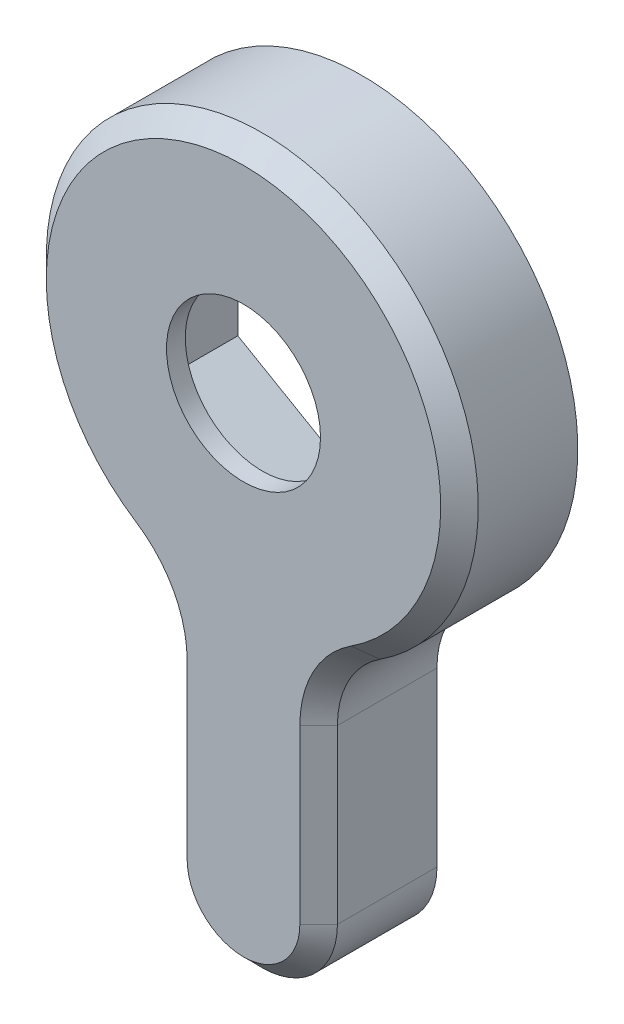
ISO-10303-21;
HEADER;
FILE_DESCRIPTION(('STEP AP214'),'2;1');
FILE_NAME('part.step','',(''),(''),'','','');
FILE_SCHEMA(('AUTOMOTIVE_DESIGN { 1 0 10303 214 1 1 1 1 }'));
ENDSEC;
DATA;
#1=APPLICATION_CONTEXT('core data for automotive mechanical design processes');
#2=APPLICATION_PROTOCOL_DEFINITION('international standard','automotive_design',2000,#1);
#3=PRODUCT_CONTEXT('',#1,'mechanical');
#4=PRODUCT('Part','Part','',(#3));
#5=PRODUCT_RELATED_PRODUCT_CATEGORY('part','',(#4));
#6=PRODUCT_DEFINITION_FORMATION('','',#4);
#7=PRODUCT_DEFINITION_CONTEXT('part definition',#1,'design');
#8=PRODUCT_DEFINITION('design','',#6,#7);
#9=PRODUCT_DEFINITION_SHAPE('','',#8);
#10=(LENGTH_UNIT() NAMED_UNIT(*) SI_UNIT(.MILLI.,.METRE.));
#11=(NAMED_UNIT(*) PLANE_ANGLE_UNIT() SI_UNIT($,.RADIAN.));
#12=(NAMED_UNIT(*) SI_UNIT($,.STERADIAN.) SOLID_ANGLE_UNIT());
#13=UNCERTAINTY_MEASURE_WITH_UNIT(LENGTH_MEASURE(1.E-05),#10,'distance_accuracy_value','');
#14=(GEOMETRIC_REPRESENTATION_CONTEXT(3) GLOBAL_UNCERTAINTY_ASSIGNED_CONTEXT((#13)) GLOBAL_UNIT_ASSIGNED_CONTEXT((#10,
#11,#12)) REPRESENTATION_CONTEXT('',''));
#15=CARTESIAN_POINT('',(0.,0.,0.));
#16=DIRECTION('',(0.,0.,1.));
#17=DIRECTION('',(1.,0.,0.));
#18=AXIS2_PLACEMENT_3D('',#15,#16,#17);
#19=CARTESIAN_POINT('',(0.,0.,-37.8269119345812));
#20=DIRECTION('',(0.,0.,1.));
#21=DIRECTION('',(1.,0.,0.));
#22=AXIS2_PLACEMENT_3D('',#19,#20,#21);
#23=CYLINDRICAL_SURFACE('',#22,11.5);
#24=DIRECTION('',(0.,0.,1.));
#25=VECTOR('',#24,1.);
#26=CARTESIAN_POINT('',(-6.27272727272727,-9.63861465989711,-37.8269119345812));
#27=LINE('',#26,#25);
#28=CARTESIAN_POINT('',(-6.27272727272727,-9.63861465989711,-5.30000000000001));
#29=VERTEX_POINT('',#28);
#30=CARTESIAN_POINT('',(-6.27272727272727,-9.63861465989711,0.));
#31=VERTEX_POINT('',#30);
#32=EDGE_CURVE('E244',#29,#31,#27,.T.);
#33=ORIENTED_EDGE('',*,*,#32,.T.);
#34=CARTESIAN_POINT('',(0.,0.,0.));
#35=DIRECTION('',(0.,0.,1.));
#36=DIRECTION('',(1.,0.,0.));
#37=AXIS2_PLACEMENT_3D('',#34,#35,#36);
#38=CIRCLE('',#37,11.5);
#39=CARTESIAN_POINT('',(6.27272727272728,-9.63861465989711,0.));
#40=VERTEX_POINT('',#39);
#41=EDGE_CURVE('E11',#31,#40,#38,.F.);
#42=ORIENTED_EDGE('',*,*,#41,.T.);
#43=DIRECTION('',(0.,0.,1.));
#44=VECTOR('',#43,1.);
#45=CARTESIAN_POINT('',(6.27272727272728,-9.63861465989711,-37.8269119345812));
#46=LINE('',#45,#44);
#47=CARTESIAN_POINT('',(6.27272727272728,-9.63861465989711,-5.30000000000001));
#48=VERTEX_POINT('',#47);
#49=EDGE_CURVE('E222',#40,#48,#46,.F.);
#50=ORIENTED_EDGE('',*,*,#49,.T.);
#51=CARTESIAN_POINT('',(0.,0.,-5.30000000000001));
#52=DIRECTION('',(0.,0.,-1.));
#53=DIRECTION('',(-1.,0.,0.));
#54=AXIS2_PLACEMENT_3D('',#51,#52,#53);
#55=CIRCLE('',#54,11.5);
#56=EDGE_CURVE('E185',#48,#29,#55,.F.);
#57=ORIENTED_EDGE('',*,*,#56,.T.);
#58=EDGE_LOOP('',(#33,#42,#50,#57));
#59=FACE_BOUND('',#58,.T.);
#60=ADVANCED_FACE('F41',(#59),#23,.T.);
#61=CARTESIAN_POINT('',(6.6,3.81051177665153,-37.8269119345812));
#62=DIRECTION('',(0.5,0.866025403784438,0.));
#63=DIRECTION('',(-0.866025403784438,0.5,0.));
#64=AXIS2_PLACEMENT_3D('',#61,#62,#63);
#65=PLANE('',#64);
#66=DIRECTION('',(-0.866025403784438,0.5,0.));
#67=VECTOR('',#66,1.);
#68=CARTESIAN_POINT('',(6.6,3.81051177665153,-5.30000000000001));
#69=LINE('',#68,#67);
#70=CARTESIAN_POINT('',(6.6,3.81051177665153,-5.30000000000001));
#71=VERTEX_POINT('',#70);
#72=CARTESIAN_POINT('',(0.,7.62102355330306,-5.30000000000001));
#73=VERTEX_POINT('',#72);
#74=EDGE_CURVE('E213',#71,#73,#69,.T.);
#75=ORIENTED_EDGE('',*,*,#74,.F.);
#76=DIRECTION('',(0.,0.,1.));
#77=VECTOR('',#76,1.);
#78=CARTESIAN_POINT('',(6.6,3.81051177665153,-37.8269119345812));
#79=LINE('',#78,#77);
#80=CARTESIAN_POINT('',(6.6,3.81051177665153,0.));
#81=VERTEX_POINT('',#80);
#82=EDGE_CURVE('E210',#71,#81,#79,.T.);
#83=ORIENTED_EDGE('',*,*,#82,.T.);
#84=DIRECTION('',(-0.866025403784439,0.5,0.));
#85=VECTOR('',#84,1.);
#86=CARTESIAN_POINT('',(6.6,3.81051177665153,0.));
#87=LINE('',#86,#85);
#88=CARTESIAN_POINT('',(0.,7.62102355330306,0.));
#89=VERTEX_POINT('',#88);
#90=EDGE_CURVE('E207',#81,#89,#87,.T.);
#91=ORIENTED_EDGE('',*,*,#90,.T.);
#92=DIRECTION('',(0.,0.,1.));
#93=VECTOR('',#92,1.);
#94=CARTESIAN_POINT('',(0.,7.62102355330306,-37.8269119345812));
#95=LINE('',#94,#93);
#96=EDGE_CURVE('E202',#73,#89,#95,.T.);
#97=ORIENTED_EDGE('',*,*,#96,.F.);
#98=EDGE_LOOP('',(#75,#83,#91,#97));
#99=FACE_BOUND('',#98,.T.);
#100=ADVANCED_FACE('F332',(#99),#65,.F.);
#101=CARTESIAN_POINT('',(6.6,-3.81051177665153,-37.8269119345812));
#102=DIRECTION('',(1.,0.,0.));
#103=DIRECTION('',(0.,0.,-1.));
#104=AXIS2_PLACEMENT_3D('',#101,#102,#103);
#105=PLANE('',#104);
#106=DIRECTION('',(0.,1.,0.));
#107=VECTOR('',#106,1.);
#108=CARTESIAN_POINT('',(6.6,-3.81051177665153,-5.30000000000001));
#109=LINE('',#108,#107);
#110=CARTESIAN_POINT('',(6.6,-3.81051177665153,-5.30000000000001));
#111=VERTEX_POINT('',#110);
#112=EDGE_CURVE('E206',#111,#71,#109,.T.);
#113=ORIENTED_EDGE('',*,*,#112,.F.);
#114=DIRECTION('',(0.,0.,1.));
#115=VECTOR('',#114,1.);
#116=CARTESIAN_POINT('',(6.6,-3.81051177665153,-37.8269119345812));
#117=LINE('',#116,#115);
#118=CARTESIAN_POINT('',(6.6,-3.81051177665153,0.));
#119=VERTEX_POINT('',#118);
#120=EDGE_CURVE('E190',#111,#119,#117,.T.);
#121=ORIENTED_EDGE('',*,*,#120,.T.);
#122=DIRECTION('',(0.,1.,0.));
#123=VECTOR('',#122,1.);
#124=CARTESIAN_POINT('',(6.6,-3.81051177665153,0.));
#125=LINE('',#124,#123);
#126=EDGE_CURVE('E186',#119,#81,#125,.T.);
#127=ORIENTED_EDGE('',*,*,#126,.T.);
#128=ORIENTED_EDGE('',*,*,#82,.F.);
#129=EDGE_LOOP('',(#113,#121,#127,#128));
#130=FACE_BOUND('',#129,.T.);
#131=ADVANCED_FACE('F337',(#130),#105,.F.);
#132=CARTESIAN_POINT('',(0.,-7.62102355330306,-37.8269119345812));
#133=DIRECTION('',(0.5,-0.866025403784438,0.));
#134=DIRECTION('',(0.866025403784438,0.5,0.));
#135=AXIS2_PLACEMENT_3D('',#132,#133,#134);
#136=PLANE('',#135);
#137=DIRECTION('',(0.866025403784438,0.5,0.));
#138=VECTOR('',#137,1.);
#139=CARTESIAN_POINT('',(0.,-7.62102355330306,-5.30000000000001));
#140=LINE('',#139,#138);
#141=CARTESIAN_POINT('',(0.,-7.62102355330306,-5.30000000000001));
#142=VERTEX_POINT('',#141);
#143=EDGE_CURVE('E219',#142,#111,#140,.T.);
#144=ORIENTED_EDGE('',*,*,#143,.F.);
#145=DIRECTION('',(0.,0.,1.));
#146=VECTOR('',#145,1.);
#147=CARTESIAN_POINT('',(0.,-7.62102355330306,-37.8269119345812));
#148=LINE('',#147,#146);
#149=CARTESIAN_POINT('',(0.,-7.62102355330306,0.));
#150=VERTEX_POINT('',#149);
#151=EDGE_CURVE('E189',#142,#150,#148,.T.);
#152=ORIENTED_EDGE('',*,*,#151,.T.);
#153=DIRECTION('',(0.866025403784438,0.5,0.));
#154=VECTOR('',#153,1.);
#155=CARTESIAN_POINT('',(0.,-7.62102355330306,0.));
#156=LINE('',#155,#154);
#157=EDGE_CURVE('E191',#150,#119,#156,.T.);
#158=ORIENTED_EDGE('',*,*,#157,.T.);
#159=ORIENTED_EDGE('',*,*,#120,.F.);
#160=EDGE_LOOP('',(#144,#152,#158,#159));
#161=FACE_BOUND('',#160,.T.);
#162=ADVANCED_FACE('F352',(#161),#136,.F.);
#163=CARTESIAN_POINT('',(-6.6,-3.81051177665153,-37.8269119345812));
#164=DIRECTION('',(-0.5,-0.866025403784439,0.));
#165=DIRECTION('',(0.866025403784439,-0.5,0.));
#166=AXIS2_PLACEMENT_3D('',#163,#164,#165);
#167=PLANE('',#166);
#168=DIRECTION('',(0.866025403784439,-0.5,0.));
#169=VECTOR('',#168,1.);
#170=CARTESIAN_POINT('',(-6.6,-3.81051177665153,-5.30000000000001));
#171=LINE('',#170,#169);
#172=CARTESIAN_POINT('',(-6.6,-3.81051177665153,-5.30000000000001));
#173=VERTEX_POINT('',#172);
#174=EDGE_CURVE('E223',#173,#142,#171,.T.);
#175=ORIENTED_EDGE('',*,*,#174,.F.);
#176=DIRECTION('',(0.,0.,1.));
#177=VECTOR('',#176,1.);
#178=CARTESIAN_POINT('',(-6.6,-3.81051177665153,-37.8269119345812));
#179=LINE('',#178,#177);
#180=CARTESIAN_POINT('',(-6.6,-3.81051177665153,0.));
#181=VERTEX_POINT('',#180);
#182=EDGE_CURVE('E194',#173,#181,#179,.T.);
#183=ORIENTED_EDGE('',*,*,#182,.T.);
#184=DIRECTION('',(0.866025403784439,-0.5,0.));
#185=VECTOR('',#184,1.);
#186=CARTESIAN_POINT('',(-6.6,-3.81051177665153,0.));
#187=LINE('',#186,#185);
#188=EDGE_CURVE('E195',#181,#150,#187,.T.);
#189=ORIENTED_EDGE('',*,*,#188,.T.);
#190=ORIENTED_EDGE('',*,*,#151,.F.);
#191=EDGE_LOOP('',(#175,#183,#189,#190));
#192=FACE_BOUND('',#191,.T.);
#193=ADVANCED_FACE('F348',(#192),#167,.F.);
#194=CARTESIAN_POINT('',(-6.6,3.81051177665153,-37.8269119345812));
#195=DIRECTION('',(-1.,0.,0.));
#196=DIRECTION('',(0.,-1.,0.));
#197=AXIS2_PLACEMENT_3D('',#194,#195,#196);
#198=PLANE('',#197);
#199=DIRECTION('',(0.,-1.,0.));
#200=VECTOR('',#199,1.);
#201=CARTESIAN_POINT('',(-6.6,3.81051177665153,-5.30000000000001));
#202=LINE('',#201,#200);
#203=CARTESIAN_POINT('',(-6.6,3.81051177665153,-5.30000000000001));
#204=VERTEX_POINT('',#203);
#205=EDGE_CURVE('E226',#204,#173,#202,.T.);
#206=ORIENTED_EDGE('',*,*,#205,.F.);
#207=DIRECTION('',(0.,0.,1.));
#208=VECTOR('',#207,1.);
#209=CARTESIAN_POINT('',(-6.6,3.81051177665153,-37.8269119345812));
#210=LINE('',#209,#208);
#211=CARTESIAN_POINT('',(-6.6,3.81051177665153,0.));
#212=VERTEX_POINT('',#211);
#213=EDGE_CURVE('E198',#204,#212,#210,.T.);
#214=ORIENTED_EDGE('',*,*,#213,.T.);
#215=DIRECTION('',(0.,-1.,0.));
#216=VECTOR('',#215,1.);
#217=CARTESIAN_POINT('',(-6.6,3.81051177665153,0.));
#218=LINE('',#217,#216);
#219=EDGE_CURVE('E199',#212,#181,#218,.T.);
#220=ORIENTED_EDGE('',*,*,#219,.T.);
#221=ORIENTED_EDGE('',*,*,#182,.F.);
#222=EDGE_LOOP('',(#206,#214,#220,#221));
#223=FACE_BOUND('',#222,.T.);
#224=ADVANCED_FACE('F344',(#223),#198,.F.);
#225=CARTESIAN_POINT('',(0.,7.62102355330306,-37.8269119345812));
#226=DIRECTION('',(-0.5,0.866025403784438,0.));
#227=DIRECTION('',(-0.866025403784439,-0.5,0.));
#228=AXIS2_PLACEMENT_3D('',#225,#226,#227);
#229=PLANE('',#228);
#230=DIRECTION('',(-0.866025403784439,-0.5,0.));
#231=VECTOR('',#230,1.);
#232=CARTESIAN_POINT('',(0.,7.62102355330306,-5.30000000000001));
#233=LINE('',#232,#231);
#234=EDGE_CURVE('E216',#73,#204,#233,.T.);
#235=ORIENTED_EDGE('',*,*,#234,.F.);
#236=ORIENTED_EDGE('',*,*,#96,.T.);
#237=DIRECTION('',(-0.866025403784438,-0.5,0.));
#238=VECTOR('',#237,1.);
#239=CARTESIAN_POINT('',(0.,7.62102355330306,0.));
#240=LINE('',#239,#238);
#241=EDGE_CURVE('E203',#89,#212,#240,.T.);
#242=ORIENTED_EDGE('',*,*,#241,.T.);
#243=ORIENTED_EDGE('',*,*,#213,.F.);
#244=EDGE_LOOP('',(#235,#236,#242,#243));
#245=FACE_BOUND('',#244,.T.);
#246=ADVANCED_FACE('F341',(#245),#229,.F.);
#247=CARTESIAN_POINT('',(0.,0.,-5.30000000000001));
#248=DIRECTION('',(0.,0.,-1.));
#249=DIRECTION('',(-0.999999767659061,-0.000681675747471521,0.));
#250=AXIS2_PLACEMENT_3D('',#247,#248,#249);
#251=PLANE('',#250);
#252=ORIENTED_EDGE('',*,*,#56,.F.);
#253=CARTESIAN_POINT('',(9.,-13.8293166859393,-5.30000000000001));
#254=DIRECTION('',(0.,0.,-1.));
#255=DIRECTION('',(-1.,0.,0.));
#256=AXIS2_PLACEMENT_3D('',#253,#254,#255);
#257=CIRCLE('',#256,5.);
#258=CARTESIAN_POINT('',(4.,-13.8293166859393,-5.30000000000001));
#259=VERTEX_POINT('',#258);
#260=EDGE_CURVE('E160',#48,#259,#257,.F.);
#261=ORIENTED_EDGE('',*,*,#260,.T.);
#262=DIRECTION('',(0.,-1.,0.));
#263=VECTOR('',#262,1.);
#264=CARTESIAN_POINT('',(4.,0.,-5.30000000000001));
#265=LINE('',#264,#263);
#266=CARTESIAN_POINT('',(4.,-23.,-5.30000000000001));
#267=VERTEX_POINT('',#266);
#268=EDGE_CURVE('E150',#259,#267,#265,.T.);
#269=ORIENTED_EDGE('',*,*,#268,.T.);
#270=CARTESIAN_POINT('',(0.,-23.,-5.30000000000001));
#271=DIRECTION('',(0.,0.,-1.));
#272=DIRECTION('',(-1.,0.,0.));
#273=AXIS2_PLACEMENT_3D('',#270,#271,#272);
#274=CIRCLE('',#273,4.);
#275=CARTESIAN_POINT('',(-4.,-23.,-5.30000000000001));
#276=VERTEX_POINT('',#275);
#277=EDGE_CURVE('E157',#276,#267,#274,.F.);
#278=ORIENTED_EDGE('',*,*,#277,.F.);
#279=DIRECTION('',(0.,-1.,0.));
#280=VECTOR('',#279,1.);
#281=CARTESIAN_POINT('',(-4.,0.,-5.30000000000001));
#282=LINE('',#281,#280);
#283=CARTESIAN_POINT('',(-4.,-13.8293166859393,-5.30000000000001));
#284=VERTEX_POINT('',#283);
#285=EDGE_CURVE('E173',#284,#276,#282,.T.);
#286=ORIENTED_EDGE('',*,*,#285,.F.);
#287=CARTESIAN_POINT('',(-9.,-13.8293166859393,-5.30000000000001));
#288=DIRECTION('',(0.,0.,-1.));
#289=DIRECTION('',(-1.,0.,0.));
#290=AXIS2_PLACEMENT_3D('',#287,#288,#289);
#291=CIRCLE('',#290,5.);
#292=EDGE_CURVE('E250',#284,#29,#291,.F.);
#293=ORIENTED_EDGE('',*,*,#292,.T.);
#294=EDGE_LOOP('',(#252,#261,#269,#278,#286,#293));
#295=FACE_BOUND('',#294,.T.);
#296=ORIENTED_EDGE('',*,*,#112,.T.);
#297=ORIENTED_EDGE('',*,*,#74,.T.);
#298=ORIENTED_EDGE('',*,*,#234,.T.);
#299=ORIENTED_EDGE('',*,*,#205,.T.);
#300=ORIENTED_EDGE('',*,*,#174,.T.);
#301=ORIENTED_EDGE('',*,*,#143,.T.);
#302=EDGE_LOOP('',(#296,#297,#298,#299,#300,#301));
#303=FACE_BOUND('',#302,.T.);
#304=ADVANCED_FACE('F153',(#295,#303),#251,.T.);
#305=CARTESIAN_POINT('',(0.,0.,0.));
#306=DIRECTION('',(0.,0.,1.));
#307=DIRECTION('',(1.,0.,0.));
#308=AXIS2_PLACEMENT_3D('',#305,#306,#307);
#309=PLANE('',#308);
#310=CARTESIAN_POINT('',(0.,0.,0.));
#311=DIRECTION('',(0.,0.,1.));
#312=DIRECTION('',(1.,0.,0.));
#313=AXIS2_PLACEMENT_3D('',#310,#311,#312);
#314=CIRCLE('',#313,4.1);
#315=CARTESIAN_POINT('',(4.1,0.,0.));
#316=VERTEX_POINT('',#315);
#317=EDGE_CURVE('E181',#316,#316,#314,.F.);
#318=ORIENTED_EDGE('',*,*,#317,.F.);
#319=EDGE_LOOP('',(#318));
#320=FACE_BOUND('',#319,.T.);
#321=ORIENTED_EDGE('',*,*,#90,.F.);
#322=ORIENTED_EDGE('',*,*,#126,.F.);
#323=ORIENTED_EDGE('',*,*,#157,.F.);
#324=ORIENTED_EDGE('',*,*,#188,.F.);
#325=ORIENTED_EDGE('',*,*,#219,.F.);
#326=ORIENTED_EDGE('',*,*,#241,.F.);
#327=EDGE_LOOP('',(#321,#322,#323,#324,#325,#326));
#328=FACE_BOUND('',#327,.T.);
#329=ADVANCED_FACE('F320',(#320,#328),#309,.F.);
#330=CARTESIAN_POINT('',(0.,0.,1.));
#331=DIRECTION('',(0.,0.,1.));
#332=DIRECTION('',(1.,0.,0.));
#333=AXIS2_PLACEMENT_3D('',#330,#331,#332);
#334=PLANE('',#333);
#335=CARTESIAN_POINT('',(0.,0.,1.));
#336=DIRECTION('',(0.,0.,1.));
#337=DIRECTION('',(1.,0.,0.));
#338=AXIS2_PLACEMENT_3D('',#335,#336,#337);
#339=CIRCLE('',#338,4.1);
#340=CARTESIAN_POINT('',(4.1,0.,0.999999999999999));
#341=VERTEX_POINT('',#340);
#342=EDGE_CURVE('E536',#341,#341,#339,.T.);
#343=ORIENTED_EDGE('',*,*,#342,.F.);
#344=EDGE_LOOP('',(#343));
#345=FACE_BOUND('',#344,.T.);
#346=DIRECTION('',(0.,-1.,0.));
#347=VECTOR('',#346,1.);
#348=CARTESIAN_POINT('',(-2.99999999999999,0.,1.));
#349=LINE('',#348,#347);
#350=CARTESIAN_POINT('',(-2.99999999999999,-13.8293166859393,1.));
#351=VERTEX_POINT('',#350);
#352=CARTESIAN_POINT('',(-2.99999999999999,-23.,1.));
#353=VERTEX_POINT('',#352);
#354=EDGE_CURVE('E259',#351,#353,#349,.T.);
#355=ORIENTED_EDGE('',*,*,#354,.T.);
#356=CARTESIAN_POINT('',(0.,-23.,1.));
#357=DIRECTION('',(0.,0.,1.));
#358=DIRECTION('',(1.,0.,0.));
#359=AXIS2_PLACEMENT_3D('',#356,#357,#358);
#360=CIRCLE('',#359,2.99999999999999);
#361=CARTESIAN_POINT('',(3.,-23.,1.));
#362=VERTEX_POINT('',#361);
#363=EDGE_CURVE('E263',#353,#362,#360,.T.);
#364=ORIENTED_EDGE('',*,*,#363,.T.);
#365=DIRECTION('',(0.,1.,0.));
#366=VECTOR('',#365,1.);
#367=CARTESIAN_POINT('',(3.,-13.8293166859393,1.));
#368=LINE('',#367,#366);
#369=CARTESIAN_POINT('',(3.,-13.8293166859393,1.));
#370=VERTEX_POINT('',#369);
#371=EDGE_CURVE('E261',#362,#370,#368,.T.);
#372=ORIENTED_EDGE('',*,*,#371,.T.);
#373=CARTESIAN_POINT('',(9.,-13.8293166859393,1.));
#374=DIRECTION('',(0.,0.,1.));
#375=DIRECTION('',(1.,0.,0.));
#376=AXIS2_PLACEMENT_3D('',#373,#374,#375);
#377=CIRCLE('',#376,6.);
#378=CARTESIAN_POINT('',(5.72727272727273,-8.80047425468866,1.));
#379=VERTEX_POINT('',#378);
#380=EDGE_CURVE('E257',#370,#379,#377,.F.);
#381=ORIENTED_EDGE('',*,*,#380,.T.);
#382=CARTESIAN_POINT('',(0.,0.,1.));
#383=DIRECTION('',(0.,0.,1.));
#384=DIRECTION('',(1.,0.,0.));
#385=AXIS2_PLACEMENT_3D('',#382,#383,#384);
#386=CIRCLE('',#385,10.5);
#387=CARTESIAN_POINT('',(-5.72727272727272,-8.80047425468866,1.));
#388=VERTEX_POINT('',#387);
#389=EDGE_CURVE('E253',#379,#388,#386,.T.);
#390=ORIENTED_EDGE('',*,*,#389,.T.);
#391=CARTESIAN_POINT('',(-9.,-13.8293166859393,1.));
#392=DIRECTION('',(0.,0.,1.));
#393=DIRECTION('',(1.,0.,0.));
#394=AXIS2_PLACEMENT_3D('',#391,#392,#393);
#395=CIRCLE('',#394,6.00000000000001);
#396=EDGE_CURVE('E255',#388,#351,#395,.F.);
#397=ORIENTED_EDGE('',*,*,#396,.T.);
#398=EDGE_LOOP('',(#355,#364,#372,#381,#390,#397));
#399=FACE_BOUND('',#398,.T.);
#400=ADVANCED_FACE('F318',(#345,#399),#334,.T.);
#401=CARTESIAN_POINT('',(0.,-23.,-23.3838551302843));
#402=DIRECTION('',(0.,0.,1.));
#403=DIRECTION('',(1.,0.,0.));
#404=AXIS2_PLACEMENT_3D('',#401,#402,#403);
#405=CYLINDRICAL_SURFACE('',#404,4.);
#406=DIRECTION('',(0.,0.,1.));
#407=VECTOR('',#406,1.);
#408=CARTESIAN_POINT('',(4.,-23.,-23.3838551302843));
#409=LINE('',#408,#407);
#410=CARTESIAN_POINT('',(4.,-23.,0.));
#411=VERTEX_POINT('',#410);
#412=EDGE_CURVE('E166',#267,#411,#409,.T.);
#413=ORIENTED_EDGE('',*,*,#412,.T.);
#414=CARTESIAN_POINT('',(0.,-23.,0.));
#415=DIRECTION('',(0.,0.,1.));
#416=DIRECTION('',(1.,0.,0.));
#417=AXIS2_PLACEMENT_3D('',#414,#415,#416);
#418=CIRCLE('',#417,4.);
#419=CARTESIAN_POINT('',(-4.,-23.,0.));
#420=VERTEX_POINT('',#419);
#421=EDGE_CURVE('E266',#411,#420,#418,.F.);
#422=ORIENTED_EDGE('',*,*,#421,.T.);
#423=DIRECTION('',(0.,0.,1.));
#424=VECTOR('',#423,1.);
#425=CARTESIAN_POINT('',(-4.,-23.,-23.3838551302843));
#426=LINE('',#425,#424);
#427=EDGE_CURVE('E177',#276,#420,#426,.T.);
#428=ORIENTED_EDGE('',*,*,#427,.F.);
#429=ORIENTED_EDGE('',*,*,#277,.T.);
#430=EDGE_LOOP('',(#413,#422,#428,#429));
#431=FACE_BOUND('',#430,.T.);
#432=ADVANCED_FACE('F175',(#431),#405,.T.);
#433=CARTESIAN_POINT('',(4.,0.,-23.3838551302843));
#434=DIRECTION('',(-1.,0.,0.));
#435=DIRECTION('',(0.,-1.,0.));
#436=AXIS2_PLACEMENT_3D('',#433,#434,#435);
#437=PLANE('',#436);
#438=DIRECTION('',(0.,0.,1.));
#439=VECTOR('',#438,1.);
#440=CARTESIAN_POINT('',(4.,-13.8293166859393,-23.3838551302843));
#441=LINE('',#440,#439);
#442=CARTESIAN_POINT('',(4.,-13.8293166859393,0.));
#443=VERTEX_POINT('',#442);
#444=EDGE_CURVE('E248',#259,#443,#441,.T.);
#445=ORIENTED_EDGE('',*,*,#444,.T.);
#446=DIRECTION('',(0.,-1.,0.));
#447=VECTOR('',#446,1.);
#448=CARTESIAN_POINT('',(4.,-23.,0.));
#449=LINE('',#448,#447);
#450=EDGE_CURVE('E169',#443,#411,#449,.T.);
#451=ORIENTED_EDGE('',*,*,#450,.T.);
#452=ORIENTED_EDGE('',*,*,#412,.F.);
#453=ORIENTED_EDGE('',*,*,#268,.F.);
#454=EDGE_LOOP('',(#445,#451,#452,#453));
#455=FACE_BOUND('',#454,.T.);
#456=ADVANCED_FACE('F167',(#455),#437,.F.);
#457=CARTESIAN_POINT('',(-4.,0.,-23.3838551302843));
#458=DIRECTION('',(-1.,0.,0.));
#459=DIRECTION('',(0.,-1.,0.));
#460=AXIS2_PLACEMENT_3D('',#457,#458,#459);
#461=PLANE('',#460);
#462=ORIENTED_EDGE('',*,*,#427,.T.);
#463=DIRECTION('',(0.,1.,0.));
#464=VECTOR('',#463,1.);
#465=CARTESIAN_POINT('',(-4.,0.,0.));
#466=LINE('',#465,#464);
#467=CARTESIAN_POINT('',(-4.,-13.8293166859393,0.));
#468=VERTEX_POINT('',#467);
#469=EDGE_CURVE('E269',#420,#468,#466,.T.);
#470=ORIENTED_EDGE('',*,*,#469,.T.);
#471=DIRECTION('',(0.,0.,-1.));
#472=VECTOR('',#471,1.);
#473=CARTESIAN_POINT('',(-4.,-13.8293166859393,-5.30000000000001));
#474=LINE('',#473,#472);
#475=EDGE_CURVE('E246',#468,#284,#474,.T.);
#476=ORIENTED_EDGE('',*,*,#475,.T.);
#477=ORIENTED_EDGE('',*,*,#285,.T.);
#478=EDGE_LOOP('',(#462,#470,#476,#477));
#479=FACE_BOUND('',#478,.T.);
#480=ADVANCED_FACE('F304',(#479),#461,.T.);
#481=CARTESIAN_POINT('',(-9.,-13.8293166859393,-37.8269119345812));
#482=DIRECTION('',(0.,0.,1.));
#483=DIRECTION('',(1.,0.,0.));
#484=AXIS2_PLACEMENT_3D('',#481,#482,#483);
#485=CYLINDRICAL_SURFACE('',#484,5.);
#486=ORIENTED_EDGE('',*,*,#475,.F.);
#487=CARTESIAN_POINT('',(-9.,-13.8293166859393,0.));
#488=DIRECTION('',(0.,0.,1.));
#489=DIRECTION('',(1.,0.,0.));
#490=AXIS2_PLACEMENT_3D('',#487,#488,#489);
#491=CIRCLE('',#490,5.);
#492=EDGE_CURVE('E51',#468,#31,#491,.T.);
#493=ORIENTED_EDGE('',*,*,#492,.T.);
#494=ORIENTED_EDGE('',*,*,#32,.F.);
#495=ORIENTED_EDGE('',*,*,#292,.F.);
#496=EDGE_LOOP('',(#486,#493,#494,#495));
#497=FACE_BOUND('',#496,.T.);
#498=ADVANCED_FACE('F302',(#497),#485,.F.);
#499=CARTESIAN_POINT('',(9.,-13.8293166859393,-37.8269119345812));
#500=DIRECTION('',(0.,0.,1.));
#501=DIRECTION('',(1.,0.,0.));
#502=AXIS2_PLACEMENT_3D('',#499,#500,#501);
#503=CYLINDRICAL_SURFACE('',#502,5.);
#504=ORIENTED_EDGE('',*,*,#49,.F.);
#505=CARTESIAN_POINT('',(9.,-13.8293166859393,0.));
#506=DIRECTION('',(0.,0.,1.));
#507=DIRECTION('',(1.,0.,0.));
#508=AXIS2_PLACEMENT_3D('',#505,#506,#507);
#509=CIRCLE('',#508,5.);
#510=EDGE_CURVE('E271',#40,#443,#509,.T.);
#511=ORIENTED_EDGE('',*,*,#510,.T.);
#512=ORIENTED_EDGE('',*,*,#444,.F.);
#513=ORIENTED_EDGE('',*,*,#260,.F.);
#514=EDGE_LOOP('',(#504,#511,#512,#513));
#515=FACE_BOUND('',#514,.T.);
#516=ADVANCED_FACE('F300',(#515),#503,.F.);
#517=CARTESIAN_POINT('',(0.,0.,1.));
#518=DIRECTION('',(0.,0.,-1.));
#519=DIRECTION('',(-1.,0.,0.));
#520=AXIS2_PLACEMENT_3D('',#517,#518,#519);
#521=CONICAL_SURFACE('',#520,10.5,0.785398163397447);
#522=DIRECTION('',(-0.385694607919936,0.592654764109331,0.707106781186548));
#523=VECTOR('',#522,1.);
#524=CARTESIAN_POINT('',(6.27272727272728,-9.63861465989711,0.));
#525=LINE('',#524,#523);
#526=EDGE_CURVE('E283',#40,#379,#525,.T.);
#527=ORIENTED_EDGE('',*,*,#526,.F.);
#528=ORIENTED_EDGE('',*,*,#41,.F.);
#529=DIRECTION('',(-0.385694607919935,-0.592654764109332,-0.707106781186548));
#530=VECTOR('',#529,1.);
#531=CARTESIAN_POINT('',(-5.72727272727272,-8.80047425468866,1.));
#532=LINE('',#531,#530);
#533=EDGE_CURVE('E46',#388,#31,#532,.T.);
#534=ORIENTED_EDGE('',*,*,#533,.F.);
#535=ORIENTED_EDGE('',*,*,#389,.F.);
#536=EDGE_LOOP('',(#527,#528,#534,#535));
#537=FACE_BOUND('',#536,.T.);
#538=ADVANCED_FACE('F44',(#537),#521,.T.);
#539=CARTESIAN_POINT('',(-9.,-13.8293166859393,1.));
#540=DIRECTION('',(0.,0.,1.));
#541=DIRECTION('',(1.,0.,0.));
#542=AXIS2_PLACEMENT_3D('',#539,#540,#541);
#543=CONICAL_SURFACE('',#542,6.00000000000001,0.785398163397447);
#544=ORIENTED_EDGE('',*,*,#533,.T.);
#545=ORIENTED_EDGE('',*,*,#492,.F.);
#546=DIRECTION('',(-0.707106781186547,0.,-0.707106781186548));
#547=VECTOR('',#546,1.);
#548=CARTESIAN_POINT('',(-2.99999999999999,-13.8293166859393,1.));
#549=LINE('',#548,#547);
#550=EDGE_CURVE('E281',#351,#468,#549,.T.);
#551=ORIENTED_EDGE('',*,*,#550,.F.);
#552=ORIENTED_EDGE('',*,*,#396,.F.);
#553=EDGE_LOOP('',(#544,#545,#551,#552));
#554=FACE_BOUND('',#553,.T.);
#555=ADVANCED_FACE('F293',(#554),#543,.F.);
#556=CARTESIAN_POINT('',(9.,-13.8293166859393,1.));
#557=DIRECTION('',(0.,0.,1.));
#558=DIRECTION('',(1.,0.,0.));
#559=AXIS2_PLACEMENT_3D('',#556,#557,#558);
#560=CONICAL_SURFACE('',#559,6.00000000000001,0.785398163397447);
#561=ORIENTED_EDGE('',*,*,#526,.T.);
#562=ORIENTED_EDGE('',*,*,#380,.F.);
#563=DIRECTION('',(-0.707106781186547,0.,0.707106781186548));
#564=VECTOR('',#563,1.);
#565=CARTESIAN_POINT('',(4.,-13.8293166859393,0.));
#566=LINE('',#565,#564);
#567=EDGE_CURVE('E278',#443,#370,#566,.T.);
#568=ORIENTED_EDGE('',*,*,#567,.F.);
#569=ORIENTED_EDGE('',*,*,#510,.F.);
#570=EDGE_LOOP('',(#561,#562,#568,#569));
#571=FACE_BOUND('',#570,.T.);
#572=ADVANCED_FACE('F298',(#571),#560,.F.);
#573=CARTESIAN_POINT('',(-2.99999999999999,0.,1.));
#574=DIRECTION('',(0.707106781186547,0.,-0.707106781186548));
#575=DIRECTION('',(0.,-1.,0.));
#576=AXIS2_PLACEMENT_3D('',#573,#574,#575);
#577=PLANE('',#576);
#578=ORIENTED_EDGE('',*,*,#550,.T.);
#579=ORIENTED_EDGE('',*,*,#469,.F.);
#580=DIRECTION('',(-0.707106781186548,0.,-0.707106781186546));
#581=VECTOR('',#580,1.);
#582=CARTESIAN_POINT('',(-2.99999999999999,-23.,1.));
#583=LINE('',#582,#581);
#584=EDGE_CURVE('E276',#353,#420,#583,.T.);
#585=ORIENTED_EDGE('',*,*,#584,.F.);
#586=ORIENTED_EDGE('',*,*,#354,.F.);
#587=EDGE_LOOP('',(#578,#579,#585,#586));
#588=FACE_BOUND('',#587,.T.);
#589=ADVANCED_FACE('F308',(#588),#577,.F.);
#590=CARTESIAN_POINT('',(4.,0.,0.));
#591=DIRECTION('',(0.707106781186547,0.,0.707106781186548));
#592=DIRECTION('',(0.,1.,0.));
#593=AXIS2_PLACEMENT_3D('',#590,#591,#592);
#594=PLANE('',#593);
#595=ORIENTED_EDGE('',*,*,#567,.T.);
#596=ORIENTED_EDGE('',*,*,#371,.F.);
#597=DIRECTION('',(-0.707106781186549,0.,0.707106781186546));
#598=VECTOR('',#597,1.);
#599=CARTESIAN_POINT('',(4.,-23.,0.));
#600=LINE('',#599,#598);
#601=EDGE_CURVE('E274',#411,#362,#600,.T.);
#602=ORIENTED_EDGE('',*,*,#601,.F.);
#603=ORIENTED_EDGE('',*,*,#450,.F.);
#604=EDGE_LOOP('',(#595,#596,#602,#603));
#605=FACE_BOUND('',#604,.T.);
#606=ADVANCED_FACE('F316',(#605),#594,.T.);
#607=CARTESIAN_POINT('',(0.,-23.,1.));
#608=DIRECTION('',(0.,0.,-1.));
#609=DIRECTION('',(-1.,0.,0.));
#610=AXIS2_PLACEMENT_3D('',#607,#608,#609);
#611=CONICAL_SURFACE('',#610,2.99999999999999,0.785398163397449);
#612=ORIENTED_EDGE('',*,*,#584,.T.);
#613=ORIENTED_EDGE('',*,*,#421,.F.);
#614=ORIENTED_EDGE('',*,*,#601,.T.);
#615=ORIENTED_EDGE('',*,*,#363,.F.);
#616=EDGE_LOOP('',(#612,#613,#614,#615));
#617=FACE_BOUND('',#616,.T.);
#618=ADVANCED_FACE('F313',(#617),#611,.T.);
#619=CARTESIAN_POINT('',(0.,0.,-5.30100000000001));
#620=DIRECTION('',(0.,0.,1.));
#621=DIRECTION('',(1.,0.,0.));
#622=AXIS2_PLACEMENT_3D('',#619,#620,#621);
#623=CYLINDRICAL_SURFACE('',#622,4.1);
#624=CARTESIAN_POINT('',(4.1,0.,0.999999999999999));
#625=CARTESIAN_POINT('',(4.1,0.,0.989583333333333));
#626=CARTESIAN_POINT('',(4.1,0.,0.979166666666666));
#627=CARTESIAN_POINT('',(4.1,0.,0.958333333333332));
#628=CARTESIAN_POINT('',(4.1,0.,0.947916666666666));
#629=CARTESIAN_POINT('',(4.1,0.,0.927083333333332));
#630=CARTESIAN_POINT('',(4.1,0.,0.916666666666666));
#631=CARTESIAN_POINT('',(4.1,0.,0.895833333333332));
#632=CARTESIAN_POINT('',(4.1,0.,0.885416666666666));
#633=CARTESIAN_POINT('',(4.1,0.,0.864583333333332));
#634=CARTESIAN_POINT('',(4.1,0.,0.854166666666666));
#635=CARTESIAN_POINT('',(4.1,0.,0.833333333333332));
#636=CARTESIAN_POINT('',(4.1,0.,0.822916666666666));
#637=CARTESIAN_POINT('',(4.1,0.,0.802083333333332));
#638=CARTESIAN_POINT('',(4.1,0.,0.791666666666666));
#639=CARTESIAN_POINT('',(4.1,0.,0.770833333333332));
#640=CARTESIAN_POINT('',(4.1,0.,0.760416666666666));
#641=CARTESIAN_POINT('',(4.1,0.,0.739583333333333));
#642=CARTESIAN_POINT('',(4.1,0.,0.729166666666666));
#643=CARTESIAN_POINT('',(4.1,0.,0.708333333333333));
#644=CARTESIAN_POINT('',(4.1,0.,0.697916666666666));
#645=CARTESIAN_POINT('',(4.1,0.,0.677083333333333));
#646=CARTESIAN_POINT('',(4.1,0.,0.666666666666666));
#647=CARTESIAN_POINT('',(4.1,0.,0.645833333333333));
#648=CARTESIAN_POINT('',(4.1,0.,0.635416666666666));
#649=CARTESIAN_POINT('',(4.1,0.,0.614583333333333));
#650=CARTESIAN_POINT('',(4.1,0.,0.604166666666666));
#651=CARTESIAN_POINT('',(4.1,0.,0.583333333333333));
#652=CARTESIAN_POINT('',(4.1,0.,0.572916666666666));
#653=CARTESIAN_POINT('',(4.1,0.,0.552083333333333));
#654=CARTESIAN_POINT('',(4.1,0.,0.541666666666666));
#655=CARTESIAN_POINT('',(4.1,0.,0.520833333333333));
#656=CARTESIAN_POINT('',(4.1,0.,0.510416666666666));
#657=CARTESIAN_POINT('',(4.1,0.,0.489583333333333));
#658=CARTESIAN_POINT('',(4.1,0.,0.479166666666666));
#659=CARTESIAN_POINT('',(4.1,0.,0.458333333333333));
#660=CARTESIAN_POINT('',(4.1,0.,0.447916666666666));
#661=CARTESIAN_POINT('',(4.1,0.,0.427083333333333));
#662=CARTESIAN_POINT('',(4.1,0.,0.416666666666666));
#663=CARTESIAN_POINT('',(4.1,0.,0.395833333333333));
#664=CARTESIAN_POINT('',(4.1,0.,0.385416666666666));
#665=CARTESIAN_POINT('',(4.1,0.,0.364583333333333));
#666=CARTESIAN_POINT('',(4.1,0.,0.354166666666666));
#667=CARTESIAN_POINT('',(4.1,0.,0.333333333333333));
#668=CARTESIAN_POINT('',(4.1,0.,0.322916666666666));
#669=CARTESIAN_POINT('',(4.1,0.,0.302083333333333));
#670=CARTESIAN_POINT('',(4.1,0.,0.291666666666667));
#671=CARTESIAN_POINT('',(4.1,0.,0.270833333333334));
#672=CARTESIAN_POINT('',(4.1,0.,0.260416666666667));
#673=CARTESIAN_POINT('',(4.1,0.,0.239583333333334));
#674=CARTESIAN_POINT('',(4.1,0.,0.229166666666667));
#675=CARTESIAN_POINT('',(4.1,0.,0.208333333333334));
#676=CARTESIAN_POINT('',(4.1,0.,0.197916666666667));
#677=CARTESIAN_POINT('',(4.1,0.,0.177083333333333));
#678=CARTESIAN_POINT('',(4.1,0.,0.166666666666667));
#679=CARTESIAN_POINT('',(4.1,0.,0.145833333333333));
#680=CARTESIAN_POINT('',(4.1,0.,0.135416666666667));
#681=CARTESIAN_POINT('',(4.1,0.,0.114583333333333));
#682=CARTESIAN_POINT('',(4.1,0.,0.104166666666667));
#683=CARTESIAN_POINT('',(4.1,0.,0.0833333333333334));
#684=CARTESIAN_POINT('',(4.1,0.,0.0729166666666667));
#685=CARTESIAN_POINT('',(4.1,0.,0.0520833333333334));
#686=CARTESIAN_POINT('',(4.1,0.,0.0416666666666667));
#687=CARTESIAN_POINT('',(4.1,0.,0.0208333333333333));
#688=CARTESIAN_POINT('',(4.1,0.,0.0104166666666667));
#689=CARTESIAN_POINT('',(4.1,0.,0.));
#690=B_SPLINE_CURVE_WITH_KNOTS('',3,(#624,#625,#626,#627,#628,#629,#630,#631,#632,#633,#634,
#635,#636,#637,#638,#639,#640,#641,#642,#643,#644,#645,#646,#647,#648,#649,#650,#651,#652,#653,
#654,#655,#656,#657,#658,#659,#660,#661,#662,#663,#664,#665,#666,#667,#668,#669,#670,#671,#672,
#673,#674,#675,#676,#677,#678,#679,#680,#681,#682,#683,#684,#685,#686,#687,#688,#689),
.UNSPECIFIED.,.F.,.F.,(4,2,2,2,2,2,2,2,2,2,2,2,2,2,2,2,2,2,2,2,2,2,2,2,2,2,2,2,2,2,2,2,4),(0.,
0.03125,0.0625000000000001,0.0937500000000001,0.125,0.15625,0.1875,0.21875,0.25,
0.281249999999999,0.312499999999999,0.343749999999999,0.374999999999999,0.40625,0.4375,0.46875,
0.5,0.53125,0.5625,0.59375,0.625,0.65625,0.6875,0.718749999999999,0.749999999999999,
0.781249999999999,0.812499999999999,0.843749999999999,0.874999999999999,0.906249999999999,
0.937499999999999,0.968749999999999,0.999999999999999),.UNSPECIFIED.);
#691=EDGE_CURVE('BSEAM372',#341,#316,#690,.T.);
#692=ORIENTED_EDGE('',*,*,#342,.T.);
#693=ORIENTED_EDGE('',*,*,#317,.T.);
#694=ORIENTED_EDGE('',*,*,#691,.T.);
#695=ORIENTED_EDGE('',*,*,#691,.F.);
#696=EDGE_LOOP('',(#692,#694,#693,#695));
#697=FACE_BOUND('',#696,.T.);
#698=ADVANCED_FACE('F372',(#697),#623,.F.);
#699=CLOSED_SHELL('',(#60,#100,#131,#162,#193,#224,#246,#304,#329,#400,#432,#456,#480,#498,#516,
#538,#555,#572,#589,#606,#618,#698));
#700=MANIFOLD_SOLID_BREP('B2',#699);
#701=ADVANCED_BREP_SHAPE_REPRESENTATION('',(#18,#700),#14);
#702=SHAPE_DEFINITION_REPRESENTATION(#9,#701);
ENDSEC;
END-ISO-10303-21;
